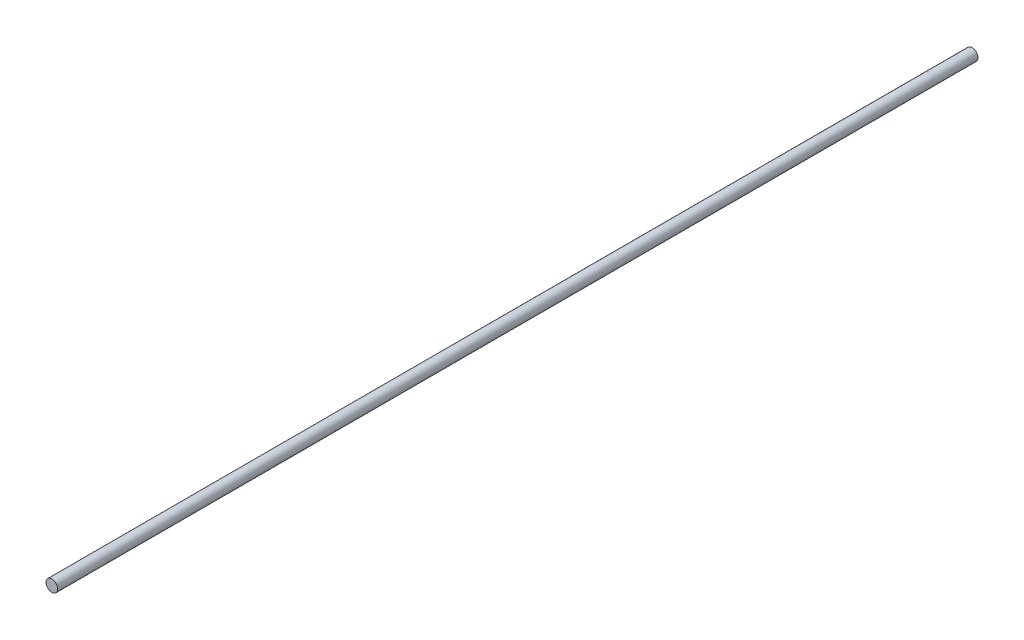
ISO-10303-21;
HEADER;
FILE_DESCRIPTION(('STEP AP214'),'2;1');
FILE_NAME('part.step','',(''),(''),'','','');
FILE_SCHEMA(('AUTOMOTIVE_DESIGN { 1 0 10303 214 1 1 1 1 }'));
ENDSEC;
DATA;
#1=APPLICATION_CONTEXT('core data for automotive mechanical design processes');
#2=APPLICATION_PROTOCOL_DEFINITION('international standard','automotive_design',2000,#1);
#3=PRODUCT_CONTEXT('',#1,'mechanical');
#4=PRODUCT('Part','Part','',(#3));
#5=PRODUCT_RELATED_PRODUCT_CATEGORY('part','',(#4));
#6=PRODUCT_DEFINITION_FORMATION('','',#4);
#7=PRODUCT_DEFINITION_CONTEXT('part definition',#1,'design');
#8=PRODUCT_DEFINITION('design','',#6,#7);
#9=PRODUCT_DEFINITION_SHAPE('','',#8);
#10=(LENGTH_UNIT() NAMED_UNIT(*) SI_UNIT(.MILLI.,.METRE.));
#11=(NAMED_UNIT(*) PLANE_ANGLE_UNIT() SI_UNIT($,.RADIAN.));
#12=(NAMED_UNIT(*) SI_UNIT($,.STERADIAN.) SOLID_ANGLE_UNIT());
#13=UNCERTAINTY_MEASURE_WITH_UNIT(LENGTH_MEASURE(1.E-05),#10,'distance_accuracy_value','');
#14=(GEOMETRIC_REPRESENTATION_CONTEXT(3) GLOBAL_UNCERTAINTY_ASSIGNED_CONTEXT((#13)) GLOBAL_UNIT_ASSIGNED_CONTEXT((#10,
#11,#12)) REPRESENTATION_CONTEXT('',''));
#15=CARTESIAN_POINT('',(0.,0.,0.));
#16=DIRECTION('',(0.,0.,1.));
#17=DIRECTION('',(1.,0.,0.));
#18=AXIS2_PLACEMENT_3D('',#15,#16,#17);
#19=CARTESIAN_POINT('',(0.,0.,630.));
#20=DIRECTION('',(0.,0.,-1.));
#21=DIRECTION('',(-1.,0.,0.));
#22=AXIS2_PLACEMENT_3D('',#19,#20,#21);
#23=CYLINDRICAL_SURFACE('',#22,4.);
#24=CARTESIAN_POINT('',(0.,0.,630.));
#25=DIRECTION('',(0.,0.,1.));
#26=DIRECTION('',(1.,0.,0.));
#27=AXIS2_PLACEMENT_3D('',#24,#25,#26);
#28=CIRCLE('',#27,4.);
#29=CARTESIAN_POINT('',(4.,0.,630.));
#30=VERTEX_POINT('',#29);
#31=EDGE_CURVE('E10',#30,#30,#28,.T.);
#32=ORIENTED_EDGE('',*,*,#31,.F.);
#33=EDGE_LOOP('',(#32));
#34=FACE_BOUND('',#33,.T.);
#35=CARTESIAN_POINT('',(0.,0.,0.));
#36=DIRECTION('',(0.,0.,1.));
#37=DIRECTION('',(1.,0.,0.));
#38=AXIS2_PLACEMENT_3D('',#35,#36,#37);
#39=CIRCLE('',#38,4.);
#40=CARTESIAN_POINT('',(4.,0.,0.));
#41=VERTEX_POINT('',#40);
#42=EDGE_CURVE('E35',#41,#41,#39,.T.);
#43=ORIENTED_EDGE('',*,*,#42,.T.);
#44=EDGE_LOOP('',(#43));
#45=FACE_BOUND('',#44,.T.);
#46=ADVANCED_FACE('F32',(#34,#45),#23,.T.);
#47=CARTESIAN_POINT('',(0.,0.,630.));
#48=DIRECTION('',(0.,0.,1.));
#49=DIRECTION('',(1.,0.,0.));
#50=AXIS2_PLACEMENT_3D('',#47,#48,#49);
#51=PLANE('',#50);
#52=ORIENTED_EDGE('',*,*,#31,.T.);
#53=EDGE_LOOP('',(#52));
#54=FACE_BOUND('',#53,.T.);
#55=ADVANCED_FACE('F47',(#54),#51,.T.);
#56=CARTESIAN_POINT('',(0.,0.,0.));
#57=DIRECTION('',(0.,0.,1.));
#58=DIRECTION('',(1.,0.,0.));
#59=AXIS2_PLACEMENT_3D('',#56,#57,#58);
#60=PLANE('',#59);
#61=ORIENTED_EDGE('',*,*,#42,.F.);
#62=EDGE_LOOP('',(#61));
#63=FACE_BOUND('',#62,.T.);
#64=ADVANCED_FACE('F45',(#63),#60,.F.);
#65=CLOSED_SHELL('',(#46,#55,#64));
#66=MANIFOLD_SOLID_BREP('B2',#65);
#67=ADVANCED_BREP_SHAPE_REPRESENTATION('',(#18,#66),#14);
#68=SHAPE_DEFINITION_REPRESENTATION(#9,#67);
ENDSEC;
END-ISO-10303-21;
